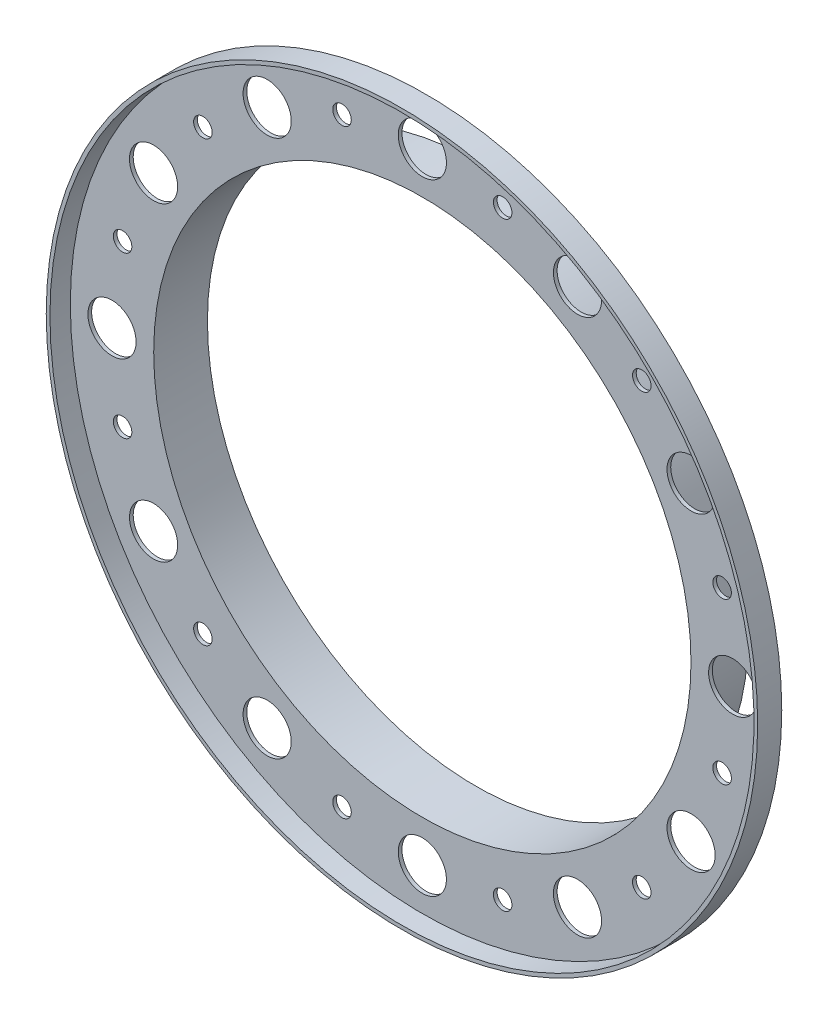
ISO-10303-21;
HEADER;
FILE_DESCRIPTION(('STEP AP214'),'2;1');
FILE_NAME('part.step','',(''),(''),'','','');
FILE_SCHEMA(('AUTOMOTIVE_DESIGN { 1 0 10303 214 1 1 1 1 }'));
ENDSEC;
DATA;
#1=APPLICATION_CONTEXT('core data for automotive mechanical design processes');
#2=APPLICATION_PROTOCOL_DEFINITION('international standard','automotive_design',2000,#1);
#3=PRODUCT_CONTEXT('',#1,'mechanical');
#4=PRODUCT('Part','Part','',(#3));
#5=PRODUCT_RELATED_PRODUCT_CATEGORY('part','',(#4));
#6=PRODUCT_DEFINITION_FORMATION('','',#4);
#7=PRODUCT_DEFINITION_CONTEXT('part definition',#1,'design');
#8=PRODUCT_DEFINITION('design','',#6,#7);
#9=PRODUCT_DEFINITION_SHAPE('','',#8);
#10=(LENGTH_UNIT() NAMED_UNIT(*) SI_UNIT(.MILLI.,.METRE.));
#11=(NAMED_UNIT(*) PLANE_ANGLE_UNIT() SI_UNIT($,.RADIAN.));
#12=(NAMED_UNIT(*) SI_UNIT($,.STERADIAN.) SOLID_ANGLE_UNIT());
#13=UNCERTAINTY_MEASURE_WITH_UNIT(LENGTH_MEASURE(1.E-05),#10,'distance_accuracy_value','');
#14=(GEOMETRIC_REPRESENTATION_CONTEXT(3) GLOBAL_UNCERTAINTY_ASSIGNED_CONTEXT((#13)) GLOBAL_UNIT_ASSIGNED_CONTEXT((#10,
#11,#12)) REPRESENTATION_CONTEXT('',''));
#15=CARTESIAN_POINT('',(0.,0.,0.));
#16=DIRECTION('',(0.,0.,1.));
#17=DIRECTION('',(1.,0.,0.));
#18=AXIS2_PLACEMENT_3D('',#15,#16,#17);
#19=CARTESIAN_POINT('',(0.,0.,0.));
#20=DIRECTION('',(0.,0.,-1.));
#21=DIRECTION('',(-1.,0.,0.));
#22=AXIS2_PLACEMENT_3D('',#19,#20,#21);
#23=CYLINDRICAL_SURFACE('',#22,38.4);
#24=CARTESIAN_POINT('',(0.,0.,8.));
#25=DIRECTION('',(0.,0.,-1.));
#26=DIRECTION('',(-1.,0.,0.));
#27=AXIS2_PLACEMENT_3D('',#24,#25,#26);
#28=CIRCLE('',#27,38.4);
#29=CARTESIAN_POINT('',(-38.4,0.,8.));
#30=VERTEX_POINT('',#29);
#31=EDGE_CURVE('E10',#30,#30,#28,.T.);
#32=ORIENTED_EDGE('',*,*,#31,.T.);
#33=EDGE_LOOP('',(#32));
#34=FACE_BOUND('',#33,.T.);
#35=CARTESIAN_POINT('',(0.,0.,5.4));
#36=DIRECTION('',(0.,0.,-1.));
#37=DIRECTION('',(-1.,0.,0.));
#38=AXIS2_PLACEMENT_3D('',#35,#36,#37);
#39=CIRCLE('',#38,38.4);
#40=CARTESIAN_POINT('',(-38.4,0.,5.4));
#41=VERTEX_POINT('',#40);
#42=EDGE_CURVE('E49',#41,#41,#39,.T.);
#43=ORIENTED_EDGE('',*,*,#42,.F.);
#44=EDGE_LOOP('',(#43));
#45=FACE_BOUND('',#44,.T.);
#46=ADVANCED_FACE('F30',(#34,#45),#23,.T.);
#47=CARTESIAN_POINT('',(0.,38.,8.));
#48=DIRECTION('',(0.,0.,-1.));
#49=DIRECTION('',(-1.,0.,0.));
#50=AXIS2_PLACEMENT_3D('',#47,#48,#49);
#51=PLANE('',#50);
#52=ORIENTED_EDGE('',*,*,#31,.F.);
#53=EDGE_LOOP('',(#52));
#54=FACE_BOUND('',#53,.T.);
#55=CARTESIAN_POINT('',(0.,0.,8.));
#56=DIRECTION('',(0.,0.,-1.));
#57=DIRECTION('',(-1.,0.,0.));
#58=AXIS2_PLACEMENT_3D('',#55,#56,#57);
#59=CIRCLE('',#58,38.);
#60=CARTESIAN_POINT('',(-38.,0.,8.));
#61=VERTEX_POINT('',#60);
#62=EDGE_CURVE('E37',#61,#61,#59,.T.);
#63=ORIENTED_EDGE('',*,*,#62,.T.);
#64=EDGE_LOOP('',(#63));
#65=FACE_BOUND('',#64,.T.);
#66=ADVANCED_FACE('F240',(#54,#65),#51,.F.);
#67=CARTESIAN_POINT('',(0.,0.,0.));
#68=DIRECTION('',(0.,0.,-1.));
#69=DIRECTION('',(-1.,0.,0.));
#70=AXIS2_PLACEMENT_3D('',#67,#68,#69);
#71=CYLINDRICAL_SURFACE('',#70,38.);
#72=ORIENTED_EDGE('',*,*,#62,.F.);
#73=EDGE_LOOP('',(#72));
#74=FACE_BOUND('',#73,.T.);
#75=CARTESIAN_POINT('',(0.,0.,5.8));
#76=DIRECTION('',(0.,0.,-1.));
#77=DIRECTION('',(-1.,0.,0.));
#78=AXIS2_PLACEMENT_3D('',#75,#76,#77);
#79=CIRCLE('',#78,38.);
#80=CARTESIAN_POINT('',(-38.,0.,5.8));
#81=VERTEX_POINT('',#80);
#82=EDGE_CURVE('E42',#81,#81,#79,.T.);
#83=ORIENTED_EDGE('',*,*,#82,.T.);
#84=EDGE_LOOP('',(#83));
#85=FACE_BOUND('',#84,.T.);
#86=ADVANCED_FACE('F207',(#74,#85),#71,.F.);
#87=CARTESIAN_POINT('',(0.,29.,5.8));
#88=DIRECTION('',(0.,0.,-1.));
#89=DIRECTION('',(-1.,0.,0.));
#90=AXIS2_PLACEMENT_3D('',#87,#88,#89);
#91=PLANE('',#90);
#92=CARTESIAN_POINT('',(-23.6880771697489,23.6880771697498,5.8));
#93=DIRECTION('',(0.,0.,1.));
#94=DIRECTION('',(0.866025403784445,0.499999999999989,0.));
#95=AXIS2_PLACEMENT_3D('',#92,#93,#94);
#96=CIRCLE('',#95,1.);
#97=CARTESIAN_POINT('',(-22.8220517659644,24.1880771697498,5.8));
#98=VERTEX_POINT('',#97);
#99=EDGE_CURVE('E146',#98,#98,#96,.T.);
#100=ORIENTED_EDGE('',*,*,#99,.F.);
#101=EDGE_LOOP('',(#100));
#102=FACE_BOUND('',#101,.T.);
#103=CARTESIAN_POINT('',(-16.7499999999996,29.0118510267789,5.8));
#104=DIRECTION('',(0.,0.,1.));
#105=DIRECTION('',(0.866025403784445,0.499999999999989,0.));
#106=AXIS2_PLACEMENT_3D('',#103,#104,#105);
#107=CIRCLE('',#106,2.6);
#108=CARTESIAN_POINT('',(-14.4983339501601,30.3118510267789,5.8));
#109=VERTEX_POINT('',#108);
#110=EDGE_CURVE('E136',#109,#109,#107,.T.);
#111=ORIENTED_EDGE('',*,*,#110,.F.);
#112=EDGE_LOOP('',(#111));
#113=FACE_BOUND('',#112,.T.);
#114=CARTESIAN_POINT('',(-32.3585151806836,8.67043801093503,5.8));
#115=DIRECTION('',(0.,0.,1.));
#116=DIRECTION('',(0.50000000000001,0.866025403784433,0.));
#117=AXIS2_PLACEMENT_3D('',#114,#115,#116);
#118=CIRCLE('',#117,1.);
#119=CARTESIAN_POINT('',(-31.8585151806836,9.53646341471946,5.8));
#120=VERTEX_POINT('',#119);
#121=EDGE_CURVE('E133',#120,#120,#118,.T.);
#122=ORIENTED_EDGE('',*,*,#121,.F.);
#123=EDGE_LOOP('',(#122));
#124=FACE_BOUND('',#123,.T.);
#125=CARTESIAN_POINT('',(-29.0118510267785,16.7500000000003,5.8));
#126=DIRECTION('',(0.,0.,1.));
#127=DIRECTION('',(0.50000000000001,0.866025403784433,0.));
#128=AXIS2_PLACEMENT_3D('',#125,#126,#127);
#129=CIRCLE('',#128,2.6);
#130=CARTESIAN_POINT('',(-27.7118510267785,19.0016660498399,5.8));
#131=VERTEX_POINT('',#130);
#132=EDGE_CURVE('E130',#131,#131,#129,.T.);
#133=ORIENTED_EDGE('',*,*,#132,.F.);
#134=EDGE_LOOP('',(#133));
#135=FACE_BOUND('',#134,.T.);
#136=CARTESIAN_POINT('',(-32.3585151806839,-8.6704380109339,5.8));
#137=DIRECTION('',(0.,0.,1.));
#138=DIRECTION('',(0.,1.,0.));
#139=AXIS2_PLACEMENT_3D('',#136,#137,#138);
#140=CIRCLE('',#139,1.);
#141=CARTESIAN_POINT('',(-32.3585151806839,-7.6704380109339,5.8));
#142=VERTEX_POINT('',#141);
#143=EDGE_CURVE('E126',#142,#142,#140,.T.);
#144=ORIENTED_EDGE('',*,*,#143,.F.);
#145=EDGE_LOOP('',(#144));
#146=FACE_BOUND('',#145,.T.);
#147=CARTESIAN_POINT('',(-33.5,3.50893874553735E-13,5.8));
#148=DIRECTION('',(0.,0.,1.));
#149=DIRECTION('',(0.,1.,0.));
#150=AXIS2_PLACEMENT_3D('',#147,#148,#149);
#151=CIRCLE('',#150,2.6);
#152=CARTESIAN_POINT('',(-33.5,2.60000000000035,5.8));
#153=VERTEX_POINT('',#152);
#154=EDGE_CURVE('E122',#153,#153,#151,.T.);
#155=ORIENTED_EDGE('',*,*,#154,.F.);
#156=EDGE_LOOP('',(#155));
#157=FACE_BOUND('',#156,.T.);
#158=CARTESIAN_POINT('',(-23.6880771697497,-23.688077169749,5.8));
#159=DIRECTION('',(0.,0.,1.));
#160=DIRECTION('',(-0.499999999999992,0.866025403784443,0.));
#161=AXIS2_PLACEMENT_3D('',#158,#159,#160);
#162=CIRCLE('',#161,1.);
#163=CARTESIAN_POINT('',(-24.1880771697497,-22.8220517659645,5.8));
#164=VERTEX_POINT('',#163);
#165=EDGE_CURVE('E118',#164,#164,#162,.T.);
#166=ORIENTED_EDGE('',*,*,#165,.F.);
#167=EDGE_LOOP('',(#166));
#168=FACE_BOUND('',#167,.T.);
#169=CARTESIAN_POINT('',(-29.0118510267789,-16.7499999999997,5.8));
#170=DIRECTION('',(0.,0.,1.));
#171=DIRECTION('',(-0.499999999999992,0.866025403784443,0.));
#172=AXIS2_PLACEMENT_3D('',#169,#170,#171);
#173=CIRCLE('',#172,2.6);
#174=CARTESIAN_POINT('',(-30.3118510267788,-14.4983339501602,5.8));
#175=VERTEX_POINT('',#174);
#176=EDGE_CURVE('E114',#175,#175,#173,.T.);
#177=ORIENTED_EDGE('',*,*,#176,.F.);
#178=EDGE_LOOP('',(#177));
#179=FACE_BOUND('',#178,.T.);
#180=CARTESIAN_POINT('',(-8.67043801093492,-32.3585151806837,5.8));
#181=DIRECTION('',(0.,0.,1.));
#182=DIRECTION('',(-0.866025403784435,0.500000000000007,0.));
#183=AXIS2_PLACEMENT_3D('',#180,#181,#182);
#184=CIRCLE('',#183,1.);
#185=CARTESIAN_POINT('',(-9.53646341471935,-31.8585151806837,5.8));
#186=VERTEX_POINT('',#185);
#187=EDGE_CURVE('E110',#186,#186,#184,.T.);
#188=ORIENTED_EDGE('',*,*,#187,.F.);
#189=EDGE_LOOP('',(#188));
#190=FACE_BOUND('',#189,.T.);
#191=CARTESIAN_POINT('',(-16.7500000000002,-29.0118510267786,5.8));
#192=DIRECTION('',(0.,0.,1.));
#193=DIRECTION('',(-0.866025403784435,0.500000000000007,0.));
#194=AXIS2_PLACEMENT_3D('',#191,#192,#193);
#195=CIRCLE('',#194,2.6);
#196=CARTESIAN_POINT('',(-19.0016660498398,-27.7118510267785,5.8));
#197=VERTEX_POINT('',#196);
#198=EDGE_CURVE('E106',#197,#197,#195,.T.);
#199=ORIENTED_EDGE('',*,*,#198,.F.);
#200=EDGE_LOOP('',(#199));
#201=FACE_BOUND('',#200,.T.);
#202=CARTESIAN_POINT('',(8.67043801093424,-32.3585151806838,5.8));
#203=DIRECTION('',(0.,0.,1.));
#204=DIRECTION('',(-1.,0.,0.));
#205=AXIS2_PLACEMENT_3D('',#202,#203,#204);
#206=CIRCLE('',#205,1.);
#207=CARTESIAN_POINT('',(7.67043801093424,-32.3585151806838,5.8));
#208=VERTEX_POINT('',#207);
#209=EDGE_CURVE('E102',#208,#208,#206,.T.);
#210=ORIENTED_EDGE('',*,*,#209,.F.);
#211=EDGE_LOOP('',(#210));
#212=FACE_BOUND('',#211,.T.);
#213=CARTESIAN_POINT('',(0.,-33.5,5.8));
#214=DIRECTION('',(0.,0.,1.));
#215=DIRECTION('',(-1.,0.,0.));
#216=AXIS2_PLACEMENT_3D('',#213,#214,#215);
#217=CIRCLE('',#216,2.6);
#218=CARTESIAN_POINT('',(-2.6,-33.5,5.8));
#219=VERTEX_POINT('',#218);
#220=EDGE_CURVE('E98',#219,#219,#217,.T.);
#221=ORIENTED_EDGE('',*,*,#220,.F.);
#222=EDGE_LOOP('',(#221));
#223=FACE_BOUND('',#222,.T.);
#224=CARTESIAN_POINT('',(23.6880771697491,-23.6880771697496,5.8));
#225=DIRECTION('',(0.,0.,1.));
#226=DIRECTION('',(-0.866025403784442,-0.499999999999995,0.));
#227=AXIS2_PLACEMENT_3D('',#224,#225,#226);
#228=CIRCLE('',#227,1.);
#229=CARTESIAN_POINT('',(22.8220517659646,-24.1880771697496,5.8));
#230=VERTEX_POINT('',#229);
#231=EDGE_CURVE('E94',#230,#230,#228,.T.);
#232=ORIENTED_EDGE('',*,*,#231,.F.);
#233=EDGE_LOOP('',(#232));
#234=FACE_BOUND('',#233,.T.);
#235=CARTESIAN_POINT('',(16.7499999999998,-29.0118510267788,5.8));
#236=DIRECTION('',(0.,0.,1.));
#237=DIRECTION('',(-0.866025403784442,-0.499999999999995,0.));
#238=AXIS2_PLACEMENT_3D('',#235,#236,#237);
#239=CIRCLE('',#238,2.6);
#240=CARTESIAN_POINT('',(14.4983339501603,-30.3118510267788,5.8));
#241=VERTEX_POINT('',#240);
#242=EDGE_CURVE('E90',#241,#241,#239,.T.);
#243=ORIENTED_EDGE('',*,*,#242,.F.);
#244=EDGE_LOOP('',(#243));
#245=FACE_BOUND('',#244,.T.);
#246=CARTESIAN_POINT('',(32.3585151806837,-8.6704380109348,5.8));
#247=DIRECTION('',(0.,0.,1.));
#248=DIRECTION('',(-0.500000000000004,-0.866025403784436,0.));
#249=AXIS2_PLACEMENT_3D('',#246,#247,#248);
#250=CIRCLE('',#249,1.);
#251=CARTESIAN_POINT('',(31.8585151806837,-9.53646341471924,5.8));
#252=VERTEX_POINT('',#251);
#253=EDGE_CURVE('E86',#252,#252,#250,.T.);
#254=ORIENTED_EDGE('',*,*,#253,.F.);
#255=EDGE_LOOP('',(#254));
#256=FACE_BOUND('',#255,.T.);
#257=CARTESIAN_POINT('',(29.0118510267786,-16.7500000000001,5.8));
#258=DIRECTION('',(0.,0.,1.));
#259=DIRECTION('',(-0.500000000000004,-0.866025403784436,0.));
#260=AXIS2_PLACEMENT_3D('',#257,#258,#259);
#261=CIRCLE('',#260,2.6);
#262=CARTESIAN_POINT('',(27.7118510267786,-19.0016660498397,5.8));
#263=VERTEX_POINT('',#262);
#264=EDGE_CURVE('E82',#263,#263,#261,.T.);
#265=ORIENTED_EDGE('',*,*,#264,.F.);
#266=EDGE_LOOP('',(#265));
#267=FACE_BOUND('',#266,.T.);
#268=CARTESIAN_POINT('',(32.3585151806839,8.67043801093413,5.8));
#269=DIRECTION('',(0.,0.,1.));
#270=DIRECTION('',(0.,-1.,0.));
#271=AXIS2_PLACEMENT_3D('',#268,#269,#270);
#272=CIRCLE('',#271,1.);
#273=CARTESIAN_POINT('',(32.3585151806839,7.67043801093413,5.8));
#274=VERTEX_POINT('',#273);
#275=EDGE_CURVE('E78',#274,#274,#272,.T.);
#276=ORIENTED_EDGE('',*,*,#275,.F.);
#277=EDGE_LOOP('',(#276));
#278=FACE_BOUND('',#277,.T.);
#279=CARTESIAN_POINT('',(33.5,-1.16964624851245E-13,5.8));
#280=DIRECTION('',(0.,0.,1.));
#281=DIRECTION('',(0.,-1.,0.));
#282=AXIS2_PLACEMENT_3D('',#279,#280,#281);
#283=CIRCLE('',#282,2.6);
#284=CARTESIAN_POINT('',(33.5,-2.60000000000012,5.8));
#285=VERTEX_POINT('',#284);
#286=EDGE_CURVE('E74',#285,#285,#283,.T.);
#287=ORIENTED_EDGE('',*,*,#286,.F.);
#288=EDGE_LOOP('',(#287));
#289=FACE_BOUND('',#288,.T.);
#290=CARTESIAN_POINT('',(23.6880771697496,23.6880771697491,5.8));
#291=DIRECTION('',(0.,0.,1.));
#292=DIRECTION('',(0.499999999999998,-0.86602540378444,0.));
#293=AXIS2_PLACEMENT_3D('',#290,#291,#292);
#294=CIRCLE('',#293,1.);
#295=CARTESIAN_POINT('',(24.1880771697495,22.8220517659647,5.8));
#296=VERTEX_POINT('',#295);
#297=EDGE_CURVE('E70',#296,#296,#294,.T.);
#298=ORIENTED_EDGE('',*,*,#297,.F.);
#299=EDGE_LOOP('',(#298));
#300=FACE_BOUND('',#299,.T.);
#301=CARTESIAN_POINT('',(29.0118510267787,16.7499999999999,5.8));
#302=DIRECTION('',(0.,0.,1.));
#303=DIRECTION('',(0.499999999999998,-0.86602540378444,0.));
#304=AXIS2_PLACEMENT_3D('',#301,#302,#303);
#305=CIRCLE('',#304,2.6);
#306=CARTESIAN_POINT('',(30.3118510267787,14.4983339501604,5.8));
#307=VERTEX_POINT('',#306);
#308=EDGE_CURVE('E66',#307,#307,#305,.T.);
#309=ORIENTED_EDGE('',*,*,#308,.F.);
#310=EDGE_LOOP('',(#309));
#311=FACE_BOUND('',#310,.T.);
#312=CARTESIAN_POINT('',(8.67043801093469,32.3585151806837,5.8));
#313=DIRECTION('',(0.,0.,1.));
#314=DIRECTION('',(0.866025403784438,-0.500000000000001,0.));
#315=AXIS2_PLACEMENT_3D('',#312,#313,#314);
#316=CIRCLE('',#315,1.);
#317=CARTESIAN_POINT('',(9.53646341471912,31.8585151806837,5.8));
#318=VERTEX_POINT('',#317);
#319=EDGE_CURVE('E62',#318,#318,#316,.T.);
#320=ORIENTED_EDGE('',*,*,#319,.F.);
#321=EDGE_LOOP('',(#320));
#322=FACE_BOUND('',#321,.T.);
#323=CARTESIAN_POINT('',(16.75,29.0118510267787,5.8));
#324=DIRECTION('',(0.,0.,1.));
#325=DIRECTION('',(0.866025403784438,-0.500000000000001,0.));
#326=AXIS2_PLACEMENT_3D('',#323,#324,#325);
#327=CIRCLE('',#326,2.6);
#328=CARTESIAN_POINT('',(19.0016660498396,27.7118510267787,5.8));
#329=VERTEX_POINT('',#328);
#330=EDGE_CURVE('E58',#329,#329,#327,.T.);
#331=ORIENTED_EDGE('',*,*,#330,.F.);
#332=EDGE_LOOP('',(#331));
#333=FACE_BOUND('',#332,.T.);
#334=CARTESIAN_POINT('',(-8.67043801093424,32.3585151806838,5.8));
#335=DIRECTION('',(0.,0.,1.));
#336=DIRECTION('',(1.,0.,0.));
#337=AXIS2_PLACEMENT_3D('',#334,#335,#336);
#338=CIRCLE('',#337,1.);
#339=CARTESIAN_POINT('',(-7.67043801093424,32.3585151806838,5.8));
#340=VERTEX_POINT('',#339);
#341=EDGE_CURVE('E54',#340,#340,#338,.T.);
#342=ORIENTED_EDGE('',*,*,#341,.F.);
#343=EDGE_LOOP('',(#342));
#344=FACE_BOUND('',#343,.T.);
#345=CARTESIAN_POINT('',(0.,33.5,5.8));
#346=DIRECTION('',(0.,0.,1.));
#347=DIRECTION('',(1.,0.,0.));
#348=AXIS2_PLACEMENT_3D('',#345,#346,#347);
#349=CIRCLE('',#348,2.6);
#350=CARTESIAN_POINT('',(2.6,33.5,5.8));
#351=VERTEX_POINT('',#350);
#352=EDGE_CURVE('E50',#351,#351,#349,.T.);
#353=ORIENTED_EDGE('',*,*,#352,.F.);
#354=EDGE_LOOP('',(#353));
#355=FACE_BOUND('',#354,.T.);
#356=ORIENTED_EDGE('',*,*,#82,.F.);
#357=EDGE_LOOP('',(#356));
#358=FACE_BOUND('',#357,.T.);
#359=CARTESIAN_POINT('',(0.,0.,5.8));
#360=DIRECTION('',(0.,0.,-1.));
#361=DIRECTION('',(-1.,0.,0.));
#362=AXIS2_PLACEMENT_3D('',#359,#360,#361);
#363=CIRCLE('',#362,29.);
#364=CARTESIAN_POINT('',(-29.,0.,5.8));
#365=VERTEX_POINT('',#364);
#366=EDGE_CURVE('E202',#365,#365,#363,.T.);
#367=ORIENTED_EDGE('',*,*,#366,.T.);
#368=EDGE_LOOP('',(#367));
#369=FACE_BOUND('',#368,.T.);
#370=ADVANCED_FACE('F209',(#102,#113,#124,#135,#146,#157,#168,#179,#190,#201,#212,#223,#234,
#245,#256,#267,#278,#289,#300,#311,#322,#333,#344,#355,#358,#369),#91,.F.);
#371=CARTESIAN_POINT('',(0.,0.,0.));
#372=DIRECTION('',(0.,0.,-1.));
#373=DIRECTION('',(-1.,0.,0.));
#374=AXIS2_PLACEMENT_3D('',#371,#372,#373);
#375=CYLINDRICAL_SURFACE('',#374,29.);
#376=ORIENTED_EDGE('',*,*,#366,.F.);
#377=EDGE_LOOP('',(#376));
#378=FACE_BOUND('',#377,.T.);
#379=CARTESIAN_POINT('',(0.,0.,0.));
#380=DIRECTION('',(0.,0.,-1.));
#381=DIRECTION('',(-1.,0.,0.));
#382=AXIS2_PLACEMENT_3D('',#379,#380,#381);
#383=CIRCLE('',#382,29.);
#384=CARTESIAN_POINT('',(-29.,0.,0.));
#385=VERTEX_POINT('',#384);
#386=EDGE_CURVE('E199',#385,#385,#383,.T.);
#387=ORIENTED_EDGE('',*,*,#386,.T.);
#388=EDGE_LOOP('',(#387));
#389=FACE_BOUND('',#388,.T.);
#390=ADVANCED_FACE('F212',(#378,#389),#375,.F.);
#391=CARTESIAN_POINT('',(0.,29.4,0.));
#392=DIRECTION('',(0.,0.,1.));
#393=DIRECTION('',(1.,0.,0.));
#394=AXIS2_PLACEMENT_3D('',#391,#392,#393);
#395=PLANE('',#394);
#396=ORIENTED_EDGE('',*,*,#386,.F.);
#397=EDGE_LOOP('',(#396));
#398=FACE_BOUND('',#397,.T.);
#399=CARTESIAN_POINT('',(0.,0.,0.));
#400=DIRECTION('',(0.,0.,-1.));
#401=DIRECTION('',(-1.,0.,0.));
#402=AXIS2_PLACEMENT_3D('',#399,#400,#401);
#403=CIRCLE('',#402,29.4);
#404=CARTESIAN_POINT('',(-29.4,0.,0.));
#405=VERTEX_POINT('',#404);
#406=EDGE_CURVE('E196',#405,#405,#403,.T.);
#407=ORIENTED_EDGE('',*,*,#406,.T.);
#408=EDGE_LOOP('',(#407));
#409=FACE_BOUND('',#408,.T.);
#410=ADVANCED_FACE('F219',(#398,#409),#395,.F.);
#411=CARTESIAN_POINT('',(0.,0.,0.));
#412=DIRECTION('',(0.,0.,-1.));
#413=DIRECTION('',(-1.,0.,0.));
#414=AXIS2_PLACEMENT_3D('',#411,#412,#413);
#415=CYLINDRICAL_SURFACE('',#414,29.4);
#416=CARTESIAN_POINT('',(0.,0.,5.4));
#417=DIRECTION('',(0.,0.,-1.));
#418=DIRECTION('',(-1.,0.,0.));
#419=AXIS2_PLACEMENT_3D('',#416,#417,#418);
#420=CIRCLE('',#419,29.4);
#421=CARTESIAN_POINT('',(-29.4,0.,5.4));
#422=VERTEX_POINT('',#421);
#423=EDGE_CURVE('E193',#422,#422,#420,.T.);
#424=ORIENTED_EDGE('',*,*,#423,.T.);
#425=EDGE_LOOP('',(#424));
#426=FACE_BOUND('',#425,.T.);
#427=ORIENTED_EDGE('',*,*,#406,.F.);
#428=EDGE_LOOP('',(#427));
#429=FACE_BOUND('',#428,.T.);
#430=ADVANCED_FACE('F225',(#426,#429),#415,.T.);
#431=CARTESIAN_POINT('',(0.,29.,5.4));
#432=DIRECTION('',(0.,0.,-1.));
#433=DIRECTION('',(-1.,0.,0.));
#434=AXIS2_PLACEMENT_3D('',#431,#432,#433);
#435=PLANE('',#434);
#436=CARTESIAN_POINT('',(-23.6880771697489,23.6880771697498,5.4));
#437=DIRECTION('',(0.,0.,-1.));
#438=DIRECTION('',(-1.,0.,0.));
#439=AXIS2_PLACEMENT_3D('',#436,#437,#438);
#440=CIRCLE('',#439,1.);
#441=CARTESIAN_POINT('',(-24.6880771697489,23.6880771697498,5.4));
#442=VERTEX_POINT('',#441);
#443=EDGE_CURVE('E33',#442,#442,#440,.T.);
#444=ORIENTED_EDGE('',*,*,#443,.F.);
#445=EDGE_LOOP('',(#444));
#446=FACE_BOUND('',#445,.T.);
#447=CARTESIAN_POINT('',(-16.7499999999996,29.0118510267789,5.4));
#448=DIRECTION('',(0.,0.,-1.));
#449=DIRECTION('',(-1.,0.,0.));
#450=AXIS2_PLACEMENT_3D('',#447,#448,#449);
#451=CIRCLE('',#450,2.6);
#452=CARTESIAN_POINT('',(-19.3499999999996,29.0118510267789,5.4));
#453=VERTEX_POINT('',#452);
#454=EDGE_CURVE('E134',#453,#453,#451,.T.);
#455=ORIENTED_EDGE('',*,*,#454,.F.);
#456=EDGE_LOOP('',(#455));
#457=FACE_BOUND('',#456,.T.);
#458=CARTESIAN_POINT('',(-32.3585151806836,8.67043801093503,5.4));
#459=DIRECTION('',(0.,0.,-1.));
#460=DIRECTION('',(-1.,0.,0.));
#461=AXIS2_PLACEMENT_3D('',#458,#459,#460);
#462=CIRCLE('',#461,1.);
#463=CARTESIAN_POINT('',(-33.3585151806836,8.67043801093503,5.4));
#464=VERTEX_POINT('',#463);
#465=EDGE_CURVE('E131',#464,#464,#462,.T.);
#466=ORIENTED_EDGE('',*,*,#465,.F.);
#467=EDGE_LOOP('',(#466));
#468=FACE_BOUND('',#467,.T.);
#469=CARTESIAN_POINT('',(-29.0118510267785,16.7500000000003,5.4));
#470=DIRECTION('',(0.,0.,-1.));
#471=DIRECTION('',(-1.,0.,0.));
#472=AXIS2_PLACEMENT_3D('',#469,#470,#471);
#473=CIRCLE('',#472,2.6);
#474=CARTESIAN_POINT('',(-31.6118510267785,16.7500000000003,5.4));
#475=VERTEX_POINT('',#474);
#476=EDGE_CURVE('E127',#475,#475,#473,.T.);
#477=ORIENTED_EDGE('',*,*,#476,.F.);
#478=EDGE_LOOP('',(#477));
#479=FACE_BOUND('',#478,.T.);
#480=CARTESIAN_POINT('',(-32.3585151806839,-8.6704380109339,5.4));
#481=DIRECTION('',(0.,0.,-1.));
#482=DIRECTION('',(-1.,0.,0.));
#483=AXIS2_PLACEMENT_3D('',#480,#481,#482);
#484=CIRCLE('',#483,1.);
#485=CARTESIAN_POINT('',(-33.3585151806839,-8.6704380109339,5.4));
#486=VERTEX_POINT('',#485);
#487=EDGE_CURVE('E123',#486,#486,#484,.T.);
#488=ORIENTED_EDGE('',*,*,#487,.F.);
#489=EDGE_LOOP('',(#488));
#490=FACE_BOUND('',#489,.T.);
#491=CARTESIAN_POINT('',(-33.5,3.50893874553735E-13,5.4));
#492=DIRECTION('',(0.,0.,-1.));
#493=DIRECTION('',(-1.,0.,0.));
#494=AXIS2_PLACEMENT_3D('',#491,#492,#493);
#495=CIRCLE('',#494,2.6);
#496=CARTESIAN_POINT('',(-36.1,3.50893874553735E-13,5.4));
#497=VERTEX_POINT('',#496);
#498=EDGE_CURVE('E119',#497,#497,#495,.T.);
#499=ORIENTED_EDGE('',*,*,#498,.F.);
#500=EDGE_LOOP('',(#499));
#501=FACE_BOUND('',#500,.T.);
#502=CARTESIAN_POINT('',(-23.6880771697497,-23.688077169749,5.4));
#503=DIRECTION('',(0.,0.,-1.));
#504=DIRECTION('',(-1.,0.,0.));
#505=AXIS2_PLACEMENT_3D('',#502,#503,#504);
#506=CIRCLE('',#505,1.);
#507=CARTESIAN_POINT('',(-24.6880771697497,-23.688077169749,5.4));
#508=VERTEX_POINT('',#507);
#509=EDGE_CURVE('E115',#508,#508,#506,.T.);
#510=ORIENTED_EDGE('',*,*,#509,.F.);
#511=EDGE_LOOP('',(#510));
#512=FACE_BOUND('',#511,.T.);
#513=CARTESIAN_POINT('',(-29.0118510267789,-16.7499999999997,5.4));
#514=DIRECTION('',(0.,0.,-1.));
#515=DIRECTION('',(-1.,0.,0.));
#516=AXIS2_PLACEMENT_3D('',#513,#514,#515);
#517=CIRCLE('',#516,2.6);
#518=CARTESIAN_POINT('',(-31.6118510267789,-16.7499999999997,5.4));
#519=VERTEX_POINT('',#518);
#520=EDGE_CURVE('E111',#519,#519,#517,.T.);
#521=ORIENTED_EDGE('',*,*,#520,.F.);
#522=EDGE_LOOP('',(#521));
#523=FACE_BOUND('',#522,.T.);
#524=CARTESIAN_POINT('',(-8.67043801093492,-32.3585151806837,5.4));
#525=DIRECTION('',(0.,0.,-1.));
#526=DIRECTION('',(-1.,0.,0.));
#527=AXIS2_PLACEMENT_3D('',#524,#525,#526);
#528=CIRCLE('',#527,1.);
#529=CARTESIAN_POINT('',(-9.67043801093492,-32.3585151806837,5.4));
#530=VERTEX_POINT('',#529);
#531=EDGE_CURVE('E107',#530,#530,#528,.T.);
#532=ORIENTED_EDGE('',*,*,#531,.F.);
#533=EDGE_LOOP('',(#532));
#534=FACE_BOUND('',#533,.T.);
#535=CARTESIAN_POINT('',(-16.7500000000002,-29.0118510267786,5.4));
#536=DIRECTION('',(0.,0.,-1.));
#537=DIRECTION('',(-1.,0.,0.));
#538=AXIS2_PLACEMENT_3D('',#535,#536,#537);
#539=CIRCLE('',#538,2.6);
#540=CARTESIAN_POINT('',(-19.3500000000002,-29.0118510267786,5.4));
#541=VERTEX_POINT('',#540);
#542=EDGE_CURVE('E103',#541,#541,#539,.T.);
#543=ORIENTED_EDGE('',*,*,#542,.F.);
#544=EDGE_LOOP('',(#543));
#545=FACE_BOUND('',#544,.T.);
#546=CARTESIAN_POINT('',(8.67043801093424,-32.3585151806838,5.4));
#547=DIRECTION('',(0.,0.,-1.));
#548=DIRECTION('',(-1.,0.,0.));
#549=AXIS2_PLACEMENT_3D('',#546,#547,#548);
#550=CIRCLE('',#549,1.);
#551=CARTESIAN_POINT('',(7.67043801093424,-32.3585151806838,5.4));
#552=VERTEX_POINT('',#551);
#553=EDGE_CURVE('E99',#552,#552,#550,.T.);
#554=ORIENTED_EDGE('',*,*,#553,.F.);
#555=EDGE_LOOP('',(#554));
#556=FACE_BOUND('',#555,.T.);
#557=CARTESIAN_POINT('',(0.,-33.5,5.4));
#558=DIRECTION('',(0.,0.,-1.));
#559=DIRECTION('',(-1.,0.,0.));
#560=AXIS2_PLACEMENT_3D('',#557,#558,#559);
#561=CIRCLE('',#560,2.6);
#562=CARTESIAN_POINT('',(-2.6,-33.5,5.4));
#563=VERTEX_POINT('',#562);
#564=EDGE_CURVE('E95',#563,#563,#561,.T.);
#565=ORIENTED_EDGE('',*,*,#564,.F.);
#566=EDGE_LOOP('',(#565));
#567=FACE_BOUND('',#566,.T.);
#568=CARTESIAN_POINT('',(23.6880771697491,-23.6880771697496,5.4));
#569=DIRECTION('',(0.,0.,-1.));
#570=DIRECTION('',(-1.,0.,0.));
#571=AXIS2_PLACEMENT_3D('',#568,#569,#570);
#572=CIRCLE('',#571,1.);
#573=CARTESIAN_POINT('',(22.6880771697491,-23.6880771697496,5.4));
#574=VERTEX_POINT('',#573);
#575=EDGE_CURVE('E91',#574,#574,#572,.T.);
#576=ORIENTED_EDGE('',*,*,#575,.F.);
#577=EDGE_LOOP('',(#576));
#578=FACE_BOUND('',#577,.T.);
#579=CARTESIAN_POINT('',(16.7499999999998,-29.0118510267788,5.4));
#580=DIRECTION('',(0.,0.,-1.));
#581=DIRECTION('',(-1.,0.,0.));
#582=AXIS2_PLACEMENT_3D('',#579,#580,#581);
#583=CIRCLE('',#582,2.6);
#584=CARTESIAN_POINT('',(14.1499999999998,-29.0118510267788,5.4));
#585=VERTEX_POINT('',#584);
#586=EDGE_CURVE('E87',#585,#585,#583,.T.);
#587=ORIENTED_EDGE('',*,*,#586,.F.);
#588=EDGE_LOOP('',(#587));
#589=FACE_BOUND('',#588,.T.);
#590=CARTESIAN_POINT('',(32.3585151806837,-8.6704380109348,5.4));
#591=DIRECTION('',(0.,0.,-1.));
#592=DIRECTION('',(-1.,0.,0.));
#593=AXIS2_PLACEMENT_3D('',#590,#591,#592);
#594=CIRCLE('',#593,1.);
#595=CARTESIAN_POINT('',(31.3585151806837,-8.6704380109348,5.4));
#596=VERTEX_POINT('',#595);
#597=EDGE_CURVE('E83',#596,#596,#594,.T.);
#598=ORIENTED_EDGE('',*,*,#597,.F.);
#599=EDGE_LOOP('',(#598));
#600=FACE_BOUND('',#599,.T.);
#601=CARTESIAN_POINT('',(29.0118510267786,-16.7500000000001,5.4));
#602=DIRECTION('',(0.,0.,-1.));
#603=DIRECTION('',(-1.,0.,0.));
#604=AXIS2_PLACEMENT_3D('',#601,#602,#603);
#605=CIRCLE('',#604,2.6);
#606=CARTESIAN_POINT('',(26.4118510267786,-16.7500000000001,5.4));
#607=VERTEX_POINT('',#606);
#608=EDGE_CURVE('E79',#607,#607,#605,.T.);
#609=ORIENTED_EDGE('',*,*,#608,.F.);
#610=EDGE_LOOP('',(#609));
#611=FACE_BOUND('',#610,.T.);
#612=CARTESIAN_POINT('',(32.3585151806839,8.67043801093413,5.4));
#613=DIRECTION('',(0.,0.,-1.));
#614=DIRECTION('',(-1.,0.,0.));
#615=AXIS2_PLACEMENT_3D('',#612,#613,#614);
#616=CIRCLE('',#615,1.);
#617=CARTESIAN_POINT('',(31.3585151806839,8.67043801093413,5.4));
#618=VERTEX_POINT('',#617);
#619=EDGE_CURVE('E75',#618,#618,#616,.T.);
#620=ORIENTED_EDGE('',*,*,#619,.F.);
#621=EDGE_LOOP('',(#620));
#622=FACE_BOUND('',#621,.T.);
#623=CARTESIAN_POINT('',(33.5,-1.16964624851245E-13,5.4));
#624=DIRECTION('',(0.,0.,-1.));
#625=DIRECTION('',(-1.,0.,0.));
#626=AXIS2_PLACEMENT_3D('',#623,#624,#625);
#627=CIRCLE('',#626,2.6);
#628=CARTESIAN_POINT('',(30.9,-1.16964624851245E-13,5.4));
#629=VERTEX_POINT('',#628);
#630=EDGE_CURVE('E71',#629,#629,#627,.T.);
#631=ORIENTED_EDGE('',*,*,#630,.F.);
#632=EDGE_LOOP('',(#631));
#633=FACE_BOUND('',#632,.T.);
#634=CARTESIAN_POINT('',(23.6880771697496,23.6880771697491,5.4));
#635=DIRECTION('',(0.,0.,-1.));
#636=DIRECTION('',(-1.,0.,0.));
#637=AXIS2_PLACEMENT_3D('',#634,#635,#636);
#638=CIRCLE('',#637,1.);
#639=CARTESIAN_POINT('',(22.6880771697495,23.6880771697491,5.4));
#640=VERTEX_POINT('',#639);
#641=EDGE_CURVE('E67',#640,#640,#638,.T.);
#642=ORIENTED_EDGE('',*,*,#641,.F.);
#643=EDGE_LOOP('',(#642));
#644=FACE_BOUND('',#643,.T.);
#645=CARTESIAN_POINT('',(29.0118510267787,16.7499999999999,5.4));
#646=DIRECTION('',(0.,0.,-1.));
#647=DIRECTION('',(-1.,0.,0.));
#648=AXIS2_PLACEMENT_3D('',#645,#646,#647);
#649=CIRCLE('',#648,2.6);
#650=CARTESIAN_POINT('',(26.4118510267787,16.7499999999999,5.4));
#651=VERTEX_POINT('',#650);
#652=EDGE_CURVE('E63',#651,#651,#649,.T.);
#653=ORIENTED_EDGE('',*,*,#652,.F.);
#654=EDGE_LOOP('',(#653));
#655=FACE_BOUND('',#654,.T.);
#656=CARTESIAN_POINT('',(8.67043801093469,32.3585151806837,5.4));
#657=DIRECTION('',(0.,0.,-1.));
#658=DIRECTION('',(-1.,0.,0.));
#659=AXIS2_PLACEMENT_3D('',#656,#657,#658);
#660=CIRCLE('',#659,1.);
#661=CARTESIAN_POINT('',(7.67043801093469,32.3585151806837,5.4));
#662=VERTEX_POINT('',#661);
#663=EDGE_CURVE('E59',#662,#662,#660,.T.);
#664=ORIENTED_EDGE('',*,*,#663,.F.);
#665=EDGE_LOOP('',(#664));
#666=FACE_BOUND('',#665,.T.);
#667=CARTESIAN_POINT('',(16.75,29.0118510267787,5.4));
#668=DIRECTION('',(0.,0.,-1.));
#669=DIRECTION('',(-1.,0.,0.));
#670=AXIS2_PLACEMENT_3D('',#667,#668,#669);
#671=CIRCLE('',#670,2.6);
#672=CARTESIAN_POINT('',(14.15,29.0118510267787,5.4));
#673=VERTEX_POINT('',#672);
#674=EDGE_CURVE('E55',#673,#673,#671,.T.);
#675=ORIENTED_EDGE('',*,*,#674,.F.);
#676=EDGE_LOOP('',(#675));
#677=FACE_BOUND('',#676,.T.);
#678=CARTESIAN_POINT('',(-8.67043801093424,32.3585151806838,5.4));
#679=DIRECTION('',(0.,0.,-1.));
#680=DIRECTION('',(-1.,0.,0.));
#681=AXIS2_PLACEMENT_3D('',#678,#679,#680);
#682=CIRCLE('',#681,1.);
#683=CARTESIAN_POINT('',(-9.67043801093424,32.3585151806838,5.4));
#684=VERTEX_POINT('',#683);
#685=EDGE_CURVE('E51',#684,#684,#682,.T.);
#686=ORIENTED_EDGE('',*,*,#685,.F.);
#687=EDGE_LOOP('',(#686));
#688=FACE_BOUND('',#687,.T.);
#689=CARTESIAN_POINT('',(0.,33.5,5.4));
#690=DIRECTION('',(0.,0.,-1.));
#691=DIRECTION('',(-1.,0.,0.));
#692=AXIS2_PLACEMENT_3D('',#689,#690,#691);
#693=CIRCLE('',#692,2.6);
#694=CARTESIAN_POINT('',(-2.6,33.5,5.4));
#695=VERTEX_POINT('',#694);
#696=EDGE_CURVE('E46',#695,#695,#693,.T.);
#697=ORIENTED_EDGE('',*,*,#696,.F.);
#698=EDGE_LOOP('',(#697));
#699=FACE_BOUND('',#698,.T.);
#700=ORIENTED_EDGE('',*,*,#42,.T.);
#701=EDGE_LOOP('',(#700));
#702=FACE_BOUND('',#701,.T.);
#703=ORIENTED_EDGE('',*,*,#423,.F.);
#704=EDGE_LOOP('',(#703));
#705=FACE_BOUND('',#704,.T.);
#706=ADVANCED_FACE('F230',(#446,#457,#468,#479,#490,#501,#512,#523,#534,#545,#556,#567,#578,
#589,#600,#611,#622,#633,#644,#655,#666,#677,#688,#699,#702,#705),#435,.T.);
#707=CARTESIAN_POINT('',(0.,33.5,0.));
#708=DIRECTION('',(0.,0.,1.));
#709=DIRECTION('',(1.,0.,0.));
#710=AXIS2_PLACEMENT_3D('',#707,#708,#709);
#711=CYLINDRICAL_SURFACE('',#710,2.6);
#712=ORIENTED_EDGE('',*,*,#696,.T.);
#713=EDGE_LOOP('',(#712));
#714=FACE_BOUND('',#713,.T.);
#715=ORIENTED_EDGE('',*,*,#352,.T.);
#716=EDGE_LOOP('',(#715));
#717=FACE_BOUND('',#716,.T.);
#718=ADVANCED_FACE('F236',(#714,#717),#711,.F.);
#719=CARTESIAN_POINT('',(-8.67043801093424,32.3585151806838,0.));
#720=DIRECTION('',(0.,0.,1.));
#721=DIRECTION('',(1.,0.,0.));
#722=AXIS2_PLACEMENT_3D('',#719,#720,#721);
#723=CYLINDRICAL_SURFACE('',#722,1.);
#724=ORIENTED_EDGE('',*,*,#685,.T.);
#725=EDGE_LOOP('',(#724));
#726=FACE_BOUND('',#725,.T.);
#727=ORIENTED_EDGE('',*,*,#341,.T.);
#728=EDGE_LOOP('',(#727));
#729=FACE_BOUND('',#728,.T.);
#730=ADVANCED_FACE('F286',(#726,#729),#723,.F.);
#731=CARTESIAN_POINT('',(16.75,29.0118510267787,0.));
#732=DIRECTION('',(0.,0.,1.));
#733=DIRECTION('',(1.,0.,0.));
#734=AXIS2_PLACEMENT_3D('',#731,#732,#733);
#735=CYLINDRICAL_SURFACE('',#734,2.6);
#736=ORIENTED_EDGE('',*,*,#674,.T.);
#737=EDGE_LOOP('',(#736));
#738=FACE_BOUND('',#737,.T.);
#739=ORIENTED_EDGE('',*,*,#330,.T.);
#740=EDGE_LOOP('',(#739));
#741=FACE_BOUND('',#740,.T.);
#742=ADVANCED_FACE('F295',(#738,#741),#735,.F.);
#743=CARTESIAN_POINT('',(8.67043801093469,32.3585151806837,0.));
#744=DIRECTION('',(0.,0.,1.));
#745=DIRECTION('',(1.,0.,0.));
#746=AXIS2_PLACEMENT_3D('',#743,#744,#745);
#747=CYLINDRICAL_SURFACE('',#746,1.);
#748=ORIENTED_EDGE('',*,*,#663,.T.);
#749=EDGE_LOOP('',(#748));
#750=FACE_BOUND('',#749,.T.);
#751=ORIENTED_EDGE('',*,*,#319,.T.);
#752=EDGE_LOOP('',(#751));
#753=FACE_BOUND('',#752,.T.);
#754=ADVANCED_FACE('F306',(#750,#753),#747,.F.);
#755=CARTESIAN_POINT('',(29.0118510267787,16.7499999999999,0.));
#756=DIRECTION('',(0.,0.,1.));
#757=DIRECTION('',(1.,0.,0.));
#758=AXIS2_PLACEMENT_3D('',#755,#756,#757);
#759=CYLINDRICAL_SURFACE('',#758,2.6);
#760=ORIENTED_EDGE('',*,*,#652,.T.);
#761=EDGE_LOOP('',(#760));
#762=FACE_BOUND('',#761,.T.);
#763=ORIENTED_EDGE('',*,*,#308,.T.);
#764=EDGE_LOOP('',(#763));
#765=FACE_BOUND('',#764,.T.);
#766=ADVANCED_FACE('F313',(#762,#765),#759,.F.);
#767=CARTESIAN_POINT('',(23.6880771697496,23.6880771697491,0.));
#768=DIRECTION('',(0.,0.,1.));
#769=DIRECTION('',(1.,0.,0.));
#770=AXIS2_PLACEMENT_3D('',#767,#768,#769);
#771=CYLINDRICAL_SURFACE('',#770,1.);
#772=ORIENTED_EDGE('',*,*,#641,.T.);
#773=EDGE_LOOP('',(#772));
#774=FACE_BOUND('',#773,.T.);
#775=ORIENTED_EDGE('',*,*,#297,.T.);
#776=EDGE_LOOP('',(#775));
#777=FACE_BOUND('',#776,.T.);
#778=ADVANCED_FACE('F321',(#774,#777),#771,.F.);
#779=CARTESIAN_POINT('',(33.5,-1.16964624851245E-13,0.));
#780=DIRECTION('',(0.,0.,1.));
#781=DIRECTION('',(1.,0.,0.));
#782=AXIS2_PLACEMENT_3D('',#779,#780,#781);
#783=CYLINDRICAL_SURFACE('',#782,2.6);
#784=ORIENTED_EDGE('',*,*,#630,.T.);
#785=EDGE_LOOP('',(#784));
#786=FACE_BOUND('',#785,.T.);
#787=ORIENTED_EDGE('',*,*,#286,.T.);
#788=EDGE_LOOP('',(#787));
#789=FACE_BOUND('',#788,.T.);
#790=ADVANCED_FACE('F329',(#786,#789),#783,.F.);
#791=CARTESIAN_POINT('',(32.3585151806839,8.67043801093413,0.));
#792=DIRECTION('',(0.,0.,1.));
#793=DIRECTION('',(1.,0.,0.));
#794=AXIS2_PLACEMENT_3D('',#791,#792,#793);
#795=CYLINDRICAL_SURFACE('',#794,1.);
#796=ORIENTED_EDGE('',*,*,#619,.T.);
#797=EDGE_LOOP('',(#796));
#798=FACE_BOUND('',#797,.T.);
#799=ORIENTED_EDGE('',*,*,#275,.T.);
#800=EDGE_LOOP('',(#799));
#801=FACE_BOUND('',#800,.T.);
#802=ADVANCED_FACE('F337',(#798,#801),#795,.F.);
#803=CARTESIAN_POINT('',(29.0118510267786,-16.7500000000001,0.));
#804=DIRECTION('',(0.,0.,1.));
#805=DIRECTION('',(1.,0.,0.));
#806=AXIS2_PLACEMENT_3D('',#803,#804,#805);
#807=CYLINDRICAL_SURFACE('',#806,2.6);
#808=ORIENTED_EDGE('',*,*,#608,.T.);
#809=EDGE_LOOP('',(#808));
#810=FACE_BOUND('',#809,.T.);
#811=ORIENTED_EDGE('',*,*,#264,.T.);
#812=EDGE_LOOP('',(#811));
#813=FACE_BOUND('',#812,.T.);
#814=ADVANCED_FACE('F345',(#810,#813),#807,.F.);
#815=CARTESIAN_POINT('',(32.3585151806837,-8.6704380109348,0.));
#816=DIRECTION('',(0.,0.,1.));
#817=DIRECTION('',(1.,0.,0.));
#818=AXIS2_PLACEMENT_3D('',#815,#816,#817);
#819=CYLINDRICAL_SURFACE('',#818,1.);
#820=ORIENTED_EDGE('',*,*,#597,.T.);
#821=EDGE_LOOP('',(#820));
#822=FACE_BOUND('',#821,.T.);
#823=ORIENTED_EDGE('',*,*,#253,.T.);
#824=EDGE_LOOP('',(#823));
#825=FACE_BOUND('',#824,.T.);
#826=ADVANCED_FACE('F353',(#822,#825),#819,.F.);
#827=CARTESIAN_POINT('',(16.7499999999998,-29.0118510267788,0.));
#828=DIRECTION('',(0.,0.,1.));
#829=DIRECTION('',(1.,0.,0.));
#830=AXIS2_PLACEMENT_3D('',#827,#828,#829);
#831=CYLINDRICAL_SURFACE('',#830,2.6);
#832=ORIENTED_EDGE('',*,*,#586,.T.);
#833=EDGE_LOOP('',(#832));
#834=FACE_BOUND('',#833,.T.);
#835=ORIENTED_EDGE('',*,*,#242,.T.);
#836=EDGE_LOOP('',(#835));
#837=FACE_BOUND('',#836,.T.);
#838=ADVANCED_FACE('F361',(#834,#837),#831,.F.);
#839=CARTESIAN_POINT('',(23.6880771697491,-23.6880771697496,0.));
#840=DIRECTION('',(0.,0.,1.));
#841=DIRECTION('',(1.,0.,0.));
#842=AXIS2_PLACEMENT_3D('',#839,#840,#841);
#843=CYLINDRICAL_SURFACE('',#842,1.);
#844=ORIENTED_EDGE('',*,*,#575,.T.);
#845=EDGE_LOOP('',(#844));
#846=FACE_BOUND('',#845,.T.);
#847=ORIENTED_EDGE('',*,*,#231,.T.);
#848=EDGE_LOOP('',(#847));
#849=FACE_BOUND('',#848,.T.);
#850=ADVANCED_FACE('F369',(#846,#849),#843,.F.);
#851=CARTESIAN_POINT('',(0.,-33.5,0.));
#852=DIRECTION('',(0.,0.,1.));
#853=DIRECTION('',(1.,0.,0.));
#854=AXIS2_PLACEMENT_3D('',#851,#852,#853);
#855=CYLINDRICAL_SURFACE('',#854,2.6);
#856=ORIENTED_EDGE('',*,*,#564,.T.);
#857=EDGE_LOOP('',(#856));
#858=FACE_BOUND('',#857,.T.);
#859=ORIENTED_EDGE('',*,*,#220,.T.);
#860=EDGE_LOOP('',(#859));
#861=FACE_BOUND('',#860,.T.);
#862=ADVANCED_FACE('F377',(#858,#861),#855,.F.);
#863=CARTESIAN_POINT('',(8.67043801093424,-32.3585151806838,0.));
#864=DIRECTION('',(0.,0.,1.));
#865=DIRECTION('',(1.,0.,0.));
#866=AXIS2_PLACEMENT_3D('',#863,#864,#865);
#867=CYLINDRICAL_SURFACE('',#866,1.);
#868=ORIENTED_EDGE('',*,*,#553,.T.);
#869=EDGE_LOOP('',(#868));
#870=FACE_BOUND('',#869,.T.);
#871=ORIENTED_EDGE('',*,*,#209,.T.);
#872=EDGE_LOOP('',(#871));
#873=FACE_BOUND('',#872,.T.);
#874=ADVANCED_FACE('F385',(#870,#873),#867,.F.);
#875=CARTESIAN_POINT('',(-16.7500000000002,-29.0118510267786,0.));
#876=DIRECTION('',(0.,0.,1.));
#877=DIRECTION('',(1.,0.,0.));
#878=AXIS2_PLACEMENT_3D('',#875,#876,#877);
#879=CYLINDRICAL_SURFACE('',#878,2.6);
#880=ORIENTED_EDGE('',*,*,#542,.T.);
#881=EDGE_LOOP('',(#880));
#882=FACE_BOUND('',#881,.T.);
#883=ORIENTED_EDGE('',*,*,#198,.T.);
#884=EDGE_LOOP('',(#883));
#885=FACE_BOUND('',#884,.T.);
#886=ADVANCED_FACE('F393',(#882,#885),#879,.F.);
#887=CARTESIAN_POINT('',(-8.67043801093492,-32.3585151806837,0.));
#888=DIRECTION('',(0.,0.,1.));
#889=DIRECTION('',(1.,0.,0.));
#890=AXIS2_PLACEMENT_3D('',#887,#888,#889);
#891=CYLINDRICAL_SURFACE('',#890,1.);
#892=ORIENTED_EDGE('',*,*,#531,.T.);
#893=EDGE_LOOP('',(#892));
#894=FACE_BOUND('',#893,.T.);
#895=ORIENTED_EDGE('',*,*,#187,.T.);
#896=EDGE_LOOP('',(#895));
#897=FACE_BOUND('',#896,.T.);
#898=ADVANCED_FACE('F401',(#894,#897),#891,.F.);
#899=CARTESIAN_POINT('',(-29.0118510267789,-16.7499999999997,0.));
#900=DIRECTION('',(0.,0.,1.));
#901=DIRECTION('',(1.,0.,0.));
#902=AXIS2_PLACEMENT_3D('',#899,#900,#901);
#903=CYLINDRICAL_SURFACE('',#902,2.6);
#904=ORIENTED_EDGE('',*,*,#520,.T.);
#905=EDGE_LOOP('',(#904));
#906=FACE_BOUND('',#905,.T.);
#907=ORIENTED_EDGE('',*,*,#176,.T.);
#908=EDGE_LOOP('',(#907));
#909=FACE_BOUND('',#908,.T.);
#910=ADVANCED_FACE('F409',(#906,#909),#903,.F.);
#911=CARTESIAN_POINT('',(-23.6880771697497,-23.688077169749,0.));
#912=DIRECTION('',(0.,0.,1.));
#913=DIRECTION('',(1.,0.,0.));
#914=AXIS2_PLACEMENT_3D('',#911,#912,#913);
#915=CYLINDRICAL_SURFACE('',#914,1.);
#916=ORIENTED_EDGE('',*,*,#509,.T.);
#917=EDGE_LOOP('',(#916));
#918=FACE_BOUND('',#917,.T.);
#919=ORIENTED_EDGE('',*,*,#165,.T.);
#920=EDGE_LOOP('',(#919));
#921=FACE_BOUND('',#920,.T.);
#922=ADVANCED_FACE('F417',(#918,#921),#915,.F.);
#923=CARTESIAN_POINT('',(-33.5,3.50893874553735E-13,0.));
#924=DIRECTION('',(0.,0.,1.));
#925=DIRECTION('',(1.,0.,0.));
#926=AXIS2_PLACEMENT_3D('',#923,#924,#925);
#927=CYLINDRICAL_SURFACE('',#926,2.6);
#928=ORIENTED_EDGE('',*,*,#498,.T.);
#929=EDGE_LOOP('',(#928));
#930=FACE_BOUND('',#929,.T.);
#931=ORIENTED_EDGE('',*,*,#154,.T.);
#932=EDGE_LOOP('',(#931));
#933=FACE_BOUND('',#932,.T.);
#934=ADVANCED_FACE('F425',(#930,#933),#927,.F.);
#935=CARTESIAN_POINT('',(-32.3585151806839,-8.6704380109339,0.));
#936=DIRECTION('',(0.,0.,1.));
#937=DIRECTION('',(1.,0.,0.));
#938=AXIS2_PLACEMENT_3D('',#935,#936,#937);
#939=CYLINDRICAL_SURFACE('',#938,1.);
#940=ORIENTED_EDGE('',*,*,#487,.T.);
#941=EDGE_LOOP('',(#940));
#942=FACE_BOUND('',#941,.T.);
#943=ORIENTED_EDGE('',*,*,#143,.T.);
#944=EDGE_LOOP('',(#943));
#945=FACE_BOUND('',#944,.T.);
#946=ADVANCED_FACE('F433',(#942,#945),#939,.F.);
#947=CARTESIAN_POINT('',(-29.0118510267785,16.7500000000003,0.));
#948=DIRECTION('',(0.,0.,1.));
#949=DIRECTION('',(1.,0.,0.));
#950=AXIS2_PLACEMENT_3D('',#947,#948,#949);
#951=CYLINDRICAL_SURFACE('',#950,2.6);
#952=ORIENTED_EDGE('',*,*,#476,.T.);
#953=EDGE_LOOP('',(#952));
#954=FACE_BOUND('',#953,.T.);
#955=ORIENTED_EDGE('',*,*,#132,.T.);
#956=EDGE_LOOP('',(#955));
#957=FACE_BOUND('',#956,.T.);
#958=ADVANCED_FACE('F441',(#954,#957),#951,.F.);
#959=CARTESIAN_POINT('',(-32.3585151806836,8.67043801093503,0.));
#960=DIRECTION('',(0.,0.,1.));
#961=DIRECTION('',(1.,0.,0.));
#962=AXIS2_PLACEMENT_3D('',#959,#960,#961);
#963=CYLINDRICAL_SURFACE('',#962,1.);
#964=ORIENTED_EDGE('',*,*,#465,.T.);
#965=EDGE_LOOP('',(#964));
#966=FACE_BOUND('',#965,.T.);
#967=ORIENTED_EDGE('',*,*,#121,.T.);
#968=EDGE_LOOP('',(#967));
#969=FACE_BOUND('',#968,.T.);
#970=ADVANCED_FACE('F449',(#966,#969),#963,.F.);
#971=CARTESIAN_POINT('',(-16.7499999999996,29.0118510267789,0.));
#972=DIRECTION('',(0.,0.,1.));
#973=DIRECTION('',(1.,0.,0.));
#974=AXIS2_PLACEMENT_3D('',#971,#972,#973);
#975=CYLINDRICAL_SURFACE('',#974,2.6);
#976=ORIENTED_EDGE('',*,*,#454,.T.);
#977=EDGE_LOOP('',(#976));
#978=FACE_BOUND('',#977,.T.);
#979=ORIENTED_EDGE('',*,*,#110,.T.);
#980=EDGE_LOOP('',(#979));
#981=FACE_BOUND('',#980,.T.);
#982=ADVANCED_FACE('F457',(#978,#981),#975,.F.);
#983=CARTESIAN_POINT('',(-23.6880771697489,23.6880771697498,0.));
#984=DIRECTION('',(0.,0.,1.));
#985=DIRECTION('',(1.,0.,0.));
#986=AXIS2_PLACEMENT_3D('',#983,#984,#985);
#987=CYLINDRICAL_SURFACE('',#986,1.);
#988=ORIENTED_EDGE('',*,*,#443,.T.);
#989=EDGE_LOOP('',(#988));
#990=FACE_BOUND('',#989,.T.);
#991=ORIENTED_EDGE('',*,*,#99,.T.);
#992=EDGE_LOOP('',(#991));
#993=FACE_BOUND('',#992,.T.);
#994=ADVANCED_FACE('F465',(#990,#993),#987,.F.);
#995=CLOSED_SHELL('',(#46,#66,#86,#370,#390,#410,#430,#706,#718,#730,#742,#754,#766,#778,#790,
#802,#814,#826,#838,#850,#862,#874,#886,#898,#910,#922,#934,#946,#958,#970,#982,#994));
#996=MANIFOLD_SOLID_BREP('B2',#995);
#997=ADVANCED_BREP_SHAPE_REPRESENTATION('',(#18,#996),#14);
#998=SHAPE_DEFINITION_REPRESENTATION(#9,#997);
ENDSEC;
END-ISO-10303-21;
